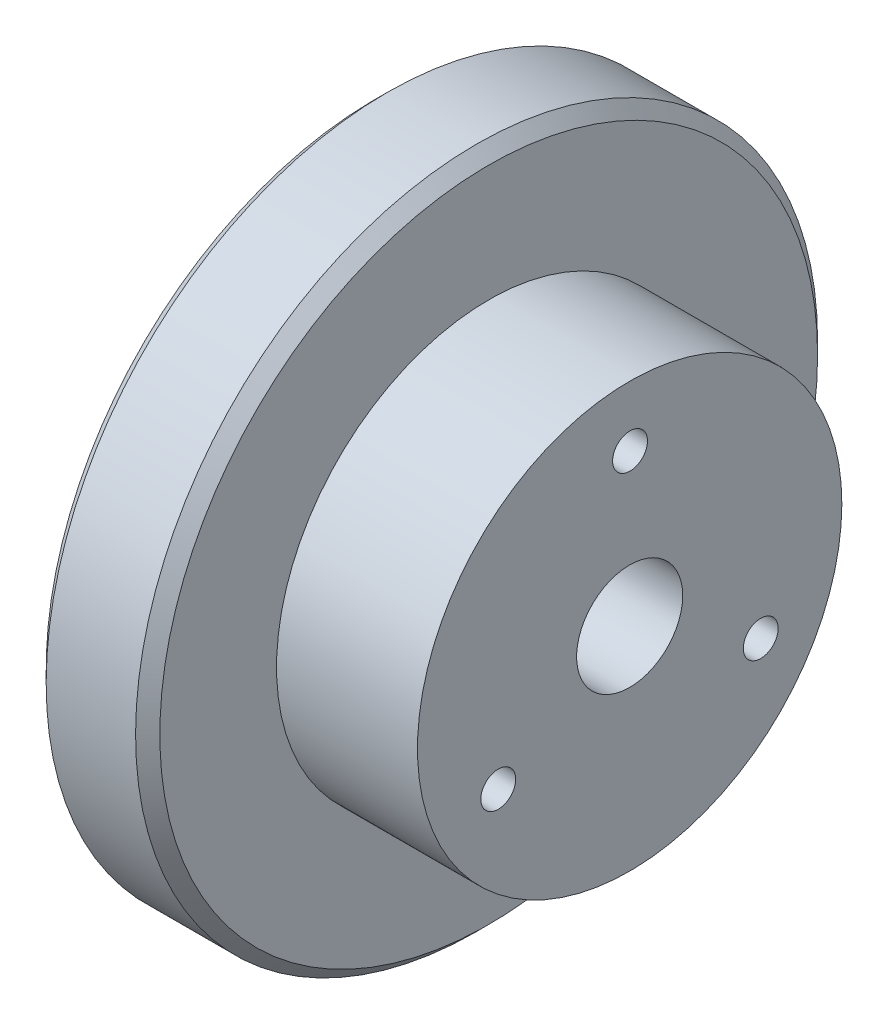
ISO-10303-21;
HEADER;
FILE_DESCRIPTION(('STEP AP214'),'2;1');
FILE_NAME('part.step','',(''),(''),'','','');
FILE_SCHEMA(('AUTOMOTIVE_DESIGN { 1 0 10303 214 1 1 1 1 }'));
ENDSEC;
DATA;
#1=APPLICATION_CONTEXT('core data for automotive mechanical design processes');
#2=APPLICATION_PROTOCOL_DEFINITION('international standard','automotive_design',2000,#1);
#3=PRODUCT_CONTEXT('',#1,'mechanical');
#4=PRODUCT('Part','Part','',(#3));
#5=PRODUCT_RELATED_PRODUCT_CATEGORY('part','',(#4));
#6=PRODUCT_DEFINITION_FORMATION('','',#4);
#7=PRODUCT_DEFINITION_CONTEXT('part definition',#1,'design');
#8=PRODUCT_DEFINITION('design','',#6,#7);
#9=PRODUCT_DEFINITION_SHAPE('','',#8);
#10=(LENGTH_UNIT() NAMED_UNIT(*) SI_UNIT(.MILLI.,.METRE.));
#11=(NAMED_UNIT(*) PLANE_ANGLE_UNIT() SI_UNIT($,.RADIAN.));
#12=(NAMED_UNIT(*) SI_UNIT($,.STERADIAN.) SOLID_ANGLE_UNIT());
#13=UNCERTAINTY_MEASURE_WITH_UNIT(LENGTH_MEASURE(1.E-05),#10,'distance_accuracy_value','');
#14=(GEOMETRIC_REPRESENTATION_CONTEXT(3) GLOBAL_UNCERTAINTY_ASSIGNED_CONTEXT((#13)) GLOBAL_UNIT_ASSIGNED_CONTEXT((#10,
#11,#12)) REPRESENTATION_CONTEXT('',''));
#15=CARTESIAN_POINT('',(0.,0.,0.));
#16=DIRECTION('',(0.,0.,1.));
#17=DIRECTION('',(1.,0.,0.));
#18=AXIS2_PLACEMENT_3D('',#15,#16,#17);
#19=CARTESIAN_POINT('',(118.399999999998,-15.4882671183042,-146.681166787616));
#20=DIRECTION('',(-1.,0.,0.));
#21=DIRECTION('',(0.,0.002501192646582,0.99999687201278));
#22=AXIS2_PLACEMENT_3D('',#19,#20,#21);
#23=CYLINDRICAL_SURFACE('',#22,1.15);
#24=CARTESIAN_POINT('',(97.399999999998,-15.4882671183042,-146.681166787616));
#25=DIRECTION('',(-1.,0.,0.));
#26=DIRECTION('',(0.,0.002501192646582,0.99999687201278));
#27=AXIS2_PLACEMENT_3D('',#24,#25,#26);
#28=CIRCLE('',#27,1.15);
#29=CARTESIAN_POINT('',(97.399999999998,-15.4853907467606,-145.531170384801));
#30=VERTEX_POINT('',#29);
#31=EDGE_CURVE('E145',#30,#30,#28,.T.);
#32=ORIENTED_EDGE('',*,*,#31,.T.);
#33=EDGE_LOOP('',(#32));
#34=FACE_BOUND('',#33,.T.);
#35=CARTESIAN_POINT('',(114.199999999998,-15.4882671183042,-146.681166787616));
#36=DIRECTION('',(1.,0.,0.));
#37=DIRECTION('',(0.,-0.002501192646582,-0.99999687201278));
#38=AXIS2_PLACEMENT_3D('',#35,#36,#37);
#39=CIRCLE('',#38,1.15);
#40=CARTESIAN_POINT('',(114.199999999998,-15.4911434898478,-147.831163190431));
#41=VERTEX_POINT('',#40);
#42=EDGE_CURVE('E116',#41,#41,#39,.T.);
#43=ORIENTED_EDGE('',*,*,#42,.T.);
#44=EDGE_LOOP('',(#43));
#45=FACE_BOUND('',#44,.T.);
#46=ADVANCED_FACE('F50',(#34,#45),#23,.F.);
#47=CARTESIAN_POINT('',(118.399999999998,-30.5098811622129,-155.303875846598));
#48=DIRECTION('',(-1.,0.,0.));
#49=DIRECTION('',(0.,0.002501192646582,0.99999687201278));
#50=AXIS2_PLACEMENT_3D('',#47,#48,#49);
#51=CYLINDRICAL_SURFACE('',#50,1.15);
#52=CARTESIAN_POINT('',(97.399999999998,-30.5098811622129,-155.303875846598));
#53=DIRECTION('',(-1.,0.,0.));
#54=DIRECTION('',(0.,0.002501192646582,0.99999687201278));
#55=AXIS2_PLACEMENT_3D('',#52,#53,#54);
#56=CIRCLE('',#55,1.15);
#57=CARTESIAN_POINT('',(97.399999999998,-30.5070047906693,-154.153879443783));
#58=VERTEX_POINT('',#57);
#59=EDGE_CURVE('E142',#58,#58,#56,.T.);
#60=ORIENTED_EDGE('',*,*,#59,.T.);
#61=EDGE_LOOP('',(#60));
#62=FACE_BOUND('',#61,.T.);
#63=CARTESIAN_POINT('',(114.199999999998,-30.5098811622129,-155.303875846598));
#64=DIRECTION('',(1.,0.,0.));
#65=DIRECTION('',(0.,-0.002501192646582,-0.99999687201278));
#66=AXIS2_PLACEMENT_3D('',#63,#64,#65);
#67=CIRCLE('',#66,1.15);
#68=CARTESIAN_POINT('',(114.199999999998,-30.5127575337565,-156.453872249412));
#69=VERTEX_POINT('',#68);
#70=EDGE_CURVE('E54',#69,#69,#67,.T.);
#71=ORIENTED_EDGE('',*,*,#70,.T.);
#72=EDGE_LOOP('',(#71));
#73=FACE_BOUND('',#72,.T.);
#74=ADVANCED_FACE('F194',(#62,#73),#51,.F.);
#75=CARTESIAN_POINT('',(118.399999999998,-30.4665592347789,-137.983421949237));
#76=DIRECTION('',(-1.,0.,0.));
#77=DIRECTION('',(0.,0.002501192646582,0.99999687201278));
#78=AXIS2_PLACEMENT_3D('',#75,#76,#77);
#79=CYLINDRICAL_SURFACE('',#78,1.15);
#80=CARTESIAN_POINT('',(97.399999999998,-30.4665592347789,-137.983421949237));
#81=DIRECTION('',(-1.,0.,0.));
#82=DIRECTION('',(0.,0.002501192646582,0.99999687201278));
#83=AXIS2_PLACEMENT_3D('',#80,#81,#82);
#84=CIRCLE('',#83,1.15);
#85=CARTESIAN_POINT('',(97.399999999998,-30.4636828632353,-136.833425546422));
#86=VERTEX_POINT('',#85);
#87=EDGE_CURVE('E139',#86,#86,#84,.T.);
#88=ORIENTED_EDGE('',*,*,#87,.T.);
#89=EDGE_LOOP('',(#88));
#90=FACE_BOUND('',#89,.T.);
#91=CARTESIAN_POINT('',(114.199999999998,-30.4665592347789,-137.983421949237));
#92=DIRECTION('',(1.,0.,0.));
#93=DIRECTION('',(0.,-0.002501192646582,-0.99999687201278));
#94=AXIS2_PLACEMENT_3D('',#91,#92,#93);
#95=CIRCLE('',#94,1.15);
#96=CARTESIAN_POINT('',(114.199999999998,-30.4694356063225,-139.133418352051));
#97=VERTEX_POINT('',#96);
#98=EDGE_CURVE('E11',#97,#97,#95,.T.);
#99=ORIENTED_EDGE('',*,*,#98,.T.);
#100=EDGE_LOOP('',(#99));
#101=FACE_BOUND('',#100,.T.);
#102=ADVANCED_FACE('F201',(#90,#101),#79,.F.);
#103=CARTESIAN_POINT('',(98.199999999998,-25.488235838432,-146.65615486115));
#104=DIRECTION('',(1.,0.,0.));
#105=DIRECTION('',(0.,-0.002501192646582,-0.99999687201278));
#106=AXIS2_PLACEMENT_3D('',#103,#104,#105);
#107=CONICAL_SURFACE('',#106,22.5,0.785398163397448);
#108=CARTESIAN_POINT('',(98.199999999998,-25.488235838432,-146.65615486115));
#109=DIRECTION('',(1.,0.,0.));
#110=DIRECTION('',(0.,-0.002501192646582,-0.99999687201278));
#111=AXIS2_PLACEMENT_3D('',#108,#109,#110);
#112=CIRCLE('',#111,22.5);
#113=CARTESIAN_POINT('',(98.199999999998,-25.5445126729801,-169.156084481438));
#114=VERTEX_POINT('',#113);
#115=EDGE_CURVE('E155',#114,#114,#112,.T.);
#116=ORIENTED_EDGE('',*,*,#115,.F.);
#117=EDGE_LOOP('',(#116));
#118=FACE_BOUND('',#117,.T.);
#119=CARTESIAN_POINT('',(97.399999999998,-25.488235838432,-146.65615486115));
#120=DIRECTION('',(-1.,0.,0.));
#121=DIRECTION('',(0.,-0.002501192646582,-0.99999687201278));
#122=AXIS2_PLACEMENT_3D('',#119,#120,#121);
#123=CIRCLE('',#122,21.7);
#124=CARTESIAN_POINT('',(97.399999999998,-25.5425117188628,-168.356086983827));
#125=VERTEX_POINT('',#124);
#126=EDGE_CURVE('E138',#125,#125,#123,.T.);
#127=ORIENTED_EDGE('',*,*,#126,.F.);
#128=EDGE_LOOP('',(#127));
#129=FACE_BOUND('',#128,.T.);
#130=ADVANCED_FACE('F206',(#118,#129),#107,.T.);
#131=CARTESIAN_POINT('',(104.899999999998,-25.488235838432,-146.65615486115));
#132=DIRECTION('',(-1.,0.,0.));
#133=DIRECTION('',(0.,0.002501192646582,0.99999687201278));
#134=AXIS2_PLACEMENT_3D('',#131,#132,#133);
#135=CONICAL_SURFACE('',#134,21.7,0.785398163397448);
#136=CARTESIAN_POINT('',(104.899999999998,-25.488235838432,-146.65615486115));
#137=DIRECTION('',(1.,0.,0.));
#138=DIRECTION('',(0.,-0.002501192646582,-0.99999687201278));
#139=AXIS2_PLACEMENT_3D('',#136,#137,#138);
#140=CIRCLE('',#139,21.7);
#141=CARTESIAN_POINT('',(104.899999999998,-25.5425117188628,-168.356086983827));
#142=VERTEX_POINT('',#141);
#143=EDGE_CURVE('E152',#142,#142,#140,.T.);
#144=ORIENTED_EDGE('',*,*,#143,.F.);
#145=EDGE_LOOP('',(#144));
#146=FACE_BOUND('',#145,.T.);
#147=CARTESIAN_POINT('',(104.099999999998,-25.488235838432,-146.65615486115));
#148=DIRECTION('',(-1.,0.,0.));
#149=DIRECTION('',(0.,-0.002501192646582,-0.99999687201278));
#150=AXIS2_PLACEMENT_3D('',#147,#148,#149);
#151=CIRCLE('',#150,22.5);
#152=CARTESIAN_POINT('',(104.099999999998,-25.5445126729801,-169.156084481438));
#153=VERTEX_POINT('',#152);
#154=EDGE_CURVE('E157',#153,#153,#151,.T.);
#155=ORIENTED_EDGE('',*,*,#154,.F.);
#156=EDGE_LOOP('',(#155));
#157=FACE_BOUND('',#156,.T.);
#158=ADVANCED_FACE('F208',(#146,#157),#135,.T.);
#159=CARTESIAN_POINT('',(114.199999999998,-25.488235838432,-146.65615486115));
#160=DIRECTION('',(1.,0.,0.));
#161=DIRECTION('',(0.,0.99999687201278,-0.002501192646582));
#162=AXIS2_PLACEMENT_3D('',#159,#160,#161);
#163=PLANE('',#162);
#164=CARTESIAN_POINT('',(114.199999999998,-25.488235838432,-146.65615486115));
#165=DIRECTION('',(1.,0.,0.));
#166=DIRECTION('',(0.,-0.002501192646582,-0.99999687201278));
#167=AXIS2_PLACEMENT_3D('',#164,#165,#166);
#168=CIRCLE('',#167,14.);
#169=CARTESIAN_POINT('',(114.199999999998,-25.5232525354842,-160.656111069329));
#170=VERTEX_POINT('',#169);
#171=EDGE_CURVE('E122',#170,#170,#168,.T.);
#172=ORIENTED_EDGE('',*,*,#171,.T.);
#173=EDGE_LOOP('',(#172));
#174=FACE_BOUND('',#173,.T.);
#175=CARTESIAN_POINT('',(114.199999999998,-25.488235838432,-146.65615486115));
#176=DIRECTION('',(1.,0.,0.));
#177=DIRECTION('',(0.,-0.002501192646582,-0.99999687201278));
#178=AXIS2_PLACEMENT_3D('',#175,#176,#177);
#179=CIRCLE('',#178,3.5);
#180=CARTESIAN_POINT('',(114.199999999998,-25.4969900126951,-150.156143913195));
#181=VERTEX_POINT('',#180);
#182=EDGE_CURVE('E162',#181,#181,#179,.T.);
#183=ORIENTED_EDGE('',*,*,#182,.F.);
#184=EDGE_LOOP('',(#183));
#185=FACE_BOUND('',#184,.T.);
#186=ORIENTED_EDGE('',*,*,#98,.F.);
#187=EDGE_LOOP('',(#186));
#188=FACE_BOUND('',#187,.T.);
#189=ORIENTED_EDGE('',*,*,#70,.F.);
#190=EDGE_LOOP('',(#189));
#191=FACE_BOUND('',#190,.T.);
#192=ORIENTED_EDGE('',*,*,#42,.F.);
#193=EDGE_LOOP('',(#192));
#194=FACE_BOUND('',#193,.T.);
#195=ADVANCED_FACE('F123',(#174,#185,#188,#191,#194),#163,.T.);
#196=CARTESIAN_POINT('',(114.199999999998,-25.488235838432,-146.65615486115));
#197=DIRECTION('',(-1.,0.,0.));
#198=DIRECTION('',(0.,0.002501192646582,0.99999687201278));
#199=AXIS2_PLACEMENT_3D('',#196,#197,#198);
#200=CYLINDRICAL_SURFACE('',#199,14.);
#201=CARTESIAN_POINT('',(104.899999999998,-25.488235838432,-146.65615486115));
#202=DIRECTION('',(1.,0.,0.));
#203=DIRECTION('',(0.,-0.002501192646582,-0.99999687201278));
#204=AXIS2_PLACEMENT_3D('',#201,#202,#203);
#205=CIRCLE('',#204,14.);
#206=CARTESIAN_POINT('',(104.899999999998,-25.5232525354842,-160.656111069329));
#207=VERTEX_POINT('',#206);
#208=EDGE_CURVE('E149',#207,#207,#205,.T.);
#209=ORIENTED_EDGE('',*,*,#208,.T.);
#210=EDGE_LOOP('',(#209));
#211=FACE_BOUND('',#210,.T.);
#212=ORIENTED_EDGE('',*,*,#171,.F.);
#213=EDGE_LOOP('',(#212));
#214=FACE_BOUND('',#213,.T.);
#215=ADVANCED_FACE('F52',(#211,#214),#200,.T.);
#216=CARTESIAN_POINT('',(102.599999999998,-25.488235838432,-146.65615486115));
#217=DIRECTION('',(-1.,0.,0.));
#218=DIRECTION('',(0.,-0.002501192646582,-0.99999687201278));
#219=AXIS2_PLACEMENT_3D('',#216,#217,#218);
#220=PLANE('',#219);
#221=CARTESIAN_POINT('',(102.599999999998,-25.488235838432,-146.65615486115));
#222=DIRECTION('',(-1.,0.,0.));
#223=DIRECTION('',(0.,0.002501192646582,0.99999687201278));
#224=AXIS2_PLACEMENT_3D('',#221,#222,#223);
#225=CIRCLE('',#224,6.6);
#226=CARTESIAN_POINT('',(102.599999999998,-25.4717279669646,-140.056175505866));
#227=VERTEX_POINT('',#226);
#228=EDGE_CURVE('E127',#227,#227,#225,.T.);
#229=ORIENTED_EDGE('',*,*,#228,.T.);
#230=EDGE_LOOP('',(#229));
#231=FACE_BOUND('',#230,.T.);
#232=CARTESIAN_POINT('',(102.599999999998,-25.488235838432,-146.65615486115));
#233=DIRECTION('',(1.,0.,0.));
#234=DIRECTION('',(0.,-0.002501192646582,-0.99999687201278));
#235=AXIS2_PLACEMENT_3D('',#232,#233,#234);
#236=CIRCLE('',#235,3.5);
#237=CARTESIAN_POINT('',(102.599999999998,-25.496990012695,-150.156143913195));
#238=VERTEX_POINT('',#237);
#239=EDGE_CURVE('E166',#238,#238,#236,.T.);
#240=ORIENTED_EDGE('',*,*,#239,.T.);
#241=EDGE_LOOP('',(#240));
#242=FACE_BOUND('',#241,.T.);
#243=ADVANCED_FACE('F175',(#231,#242),#220,.T.);
#244=CARTESIAN_POINT('',(102.599999999998,-25.488235838432,-146.65615486115));
#245=DIRECTION('',(-1.,0.,0.));
#246=DIRECTION('',(0.,0.002501192646582,0.99999687201278));
#247=AXIS2_PLACEMENT_3D('',#244,#245,#246);
#248=CYLINDRICAL_SURFACE('',#247,6.6);
#249=CARTESIAN_POINT('',(97.399999999998,-25.488235838432,-146.65615486115));
#250=DIRECTION('',(-1.,0.,0.));
#251=DIRECTION('',(0.,0.002501192646582,0.99999687201278));
#252=AXIS2_PLACEMENT_3D('',#249,#250,#251);
#253=CIRCLE('',#252,6.6);
#254=CARTESIAN_POINT('',(97.399999999998,-25.4717279669646,-140.056175505866));
#255=VERTEX_POINT('',#254);
#256=EDGE_CURVE('E133',#255,#255,#253,.T.);
#257=ORIENTED_EDGE('',*,*,#256,.T.);
#258=EDGE_LOOP('',(#257));
#259=FACE_BOUND('',#258,.T.);
#260=ORIENTED_EDGE('',*,*,#228,.F.);
#261=EDGE_LOOP('',(#260));
#262=FACE_BOUND('',#261,.T.);
#263=ADVANCED_FACE('F225',(#259,#262),#248,.F.);
#264=CARTESIAN_POINT('',(97.399999999998,-25.488235838432,-146.65615486115));
#265=DIRECTION('',(1.,0.,0.));
#266=DIRECTION('',(0.,0.99999687201278,-0.002501192646582));
#267=AXIS2_PLACEMENT_3D('',#264,#265,#266);
#268=PLANE('',#267);
#269=ORIENTED_EDGE('',*,*,#256,.F.);
#270=EDGE_LOOP('',(#269));
#271=FACE_BOUND('',#270,.T.);
#272=ORIENTED_EDGE('',*,*,#126,.T.);
#273=EDGE_LOOP('',(#272));
#274=FACE_BOUND('',#273,.T.);
#275=ORIENTED_EDGE('',*,*,#87,.F.);
#276=EDGE_LOOP('',(#275));
#277=FACE_BOUND('',#276,.T.);
#278=ORIENTED_EDGE('',*,*,#59,.F.);
#279=EDGE_LOOP('',(#278));
#280=FACE_BOUND('',#279,.T.);
#281=ORIENTED_EDGE('',*,*,#31,.F.);
#282=EDGE_LOOP('',(#281));
#283=FACE_BOUND('',#282,.T.);
#284=ADVANCED_FACE('F222',(#271,#274,#277,#280,#283),#268,.F.);
#285=CARTESIAN_POINT('',(104.899999999998,-25.488235838432,-146.65615486115));
#286=DIRECTION('',(1.,0.,0.));
#287=DIRECTION('',(0.,0.99999687201278,-0.002501192646582));
#288=AXIS2_PLACEMENT_3D('',#285,#286,#287);
#289=PLANE('',#288);
#290=ORIENTED_EDGE('',*,*,#208,.F.);
#291=EDGE_LOOP('',(#290));
#292=FACE_BOUND('',#291,.T.);
#293=ORIENTED_EDGE('',*,*,#143,.T.);
#294=EDGE_LOOP('',(#293));
#295=FACE_BOUND('',#294,.T.);
#296=ADVANCED_FACE('F188',(#292,#295),#289,.T.);
#297=CARTESIAN_POINT('',(104.899999999998,-25.488235838432,-146.65615486115));
#298=DIRECTION('',(-1.,0.,0.));
#299=DIRECTION('',(0.,0.002501192646582,0.99999687201278));
#300=AXIS2_PLACEMENT_3D('',#297,#298,#299);
#301=CYLINDRICAL_SURFACE('',#300,22.5);
#302=ORIENTED_EDGE('',*,*,#115,.T.);
#303=EDGE_LOOP('',(#302));
#304=FACE_BOUND('',#303,.T.);
#305=ORIENTED_EDGE('',*,*,#154,.T.);
#306=EDGE_LOOP('',(#305));
#307=FACE_BOUND('',#306,.T.);
#308=ADVANCED_FACE('F181',(#304,#307),#301,.T.);
#309=CARTESIAN_POINT('',(104.899999999998,-25.488235838432,-146.65615486115));
#310=DIRECTION('',(-1.,0.,0.));
#311=DIRECTION('',(0.,0.002501192646582,0.99999687201278));
#312=AXIS2_PLACEMENT_3D('',#309,#310,#311);
#313=CYLINDRICAL_SURFACE('',#312,3.5);
#314=ORIENTED_EDGE('',*,*,#182,.T.);
#315=EDGE_LOOP('',(#314));
#316=FACE_BOUND('',#315,.T.);
#317=ORIENTED_EDGE('',*,*,#239,.F.);
#318=EDGE_LOOP('',(#317));
#319=FACE_BOUND('',#318,.T.);
#320=ADVANCED_FACE('F179',(#316,#319),#313,.F.);
#321=CLOSED_SHELL('',(#46,#74,#102,#130,#158,#195,#215,#243,#263,#284,#296,#308,#320));
#322=MANIFOLD_SOLID_BREP('B2',#321);
#323=ADVANCED_BREP_SHAPE_REPRESENTATION('',(#18,#322),#14);
#324=SHAPE_DEFINITION_REPRESENTATION(#9,#323);
ENDSEC;
END-ISO-10303-21;
